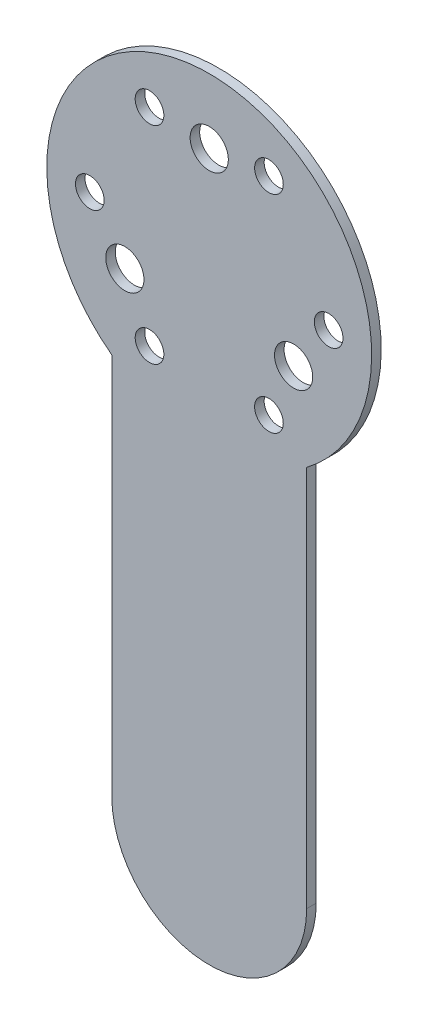
ISO-10303-21;
HEADER;
FILE_DESCRIPTION(('STEP AP214'),'2;1');
FILE_NAME('part.step','',(''),(''),'','','');
FILE_SCHEMA(('AUTOMOTIVE_DESIGN { 1 0 10303 214 1 1 1 1 }'));
ENDSEC;
DATA;
#1=APPLICATION_CONTEXT('core data for automotive mechanical design processes');
#2=APPLICATION_PROTOCOL_DEFINITION('international standard','automotive_design',2000,#1);
#3=PRODUCT_CONTEXT('',#1,'mechanical');
#4=PRODUCT('Part','Part','',(#3));
#5=PRODUCT_RELATED_PRODUCT_CATEGORY('part','',(#4));
#6=PRODUCT_DEFINITION_FORMATION('','',#4);
#7=PRODUCT_DEFINITION_CONTEXT('part definition',#1,'design');
#8=PRODUCT_DEFINITION('design','',#6,#7);
#9=PRODUCT_DEFINITION_SHAPE('','',#8);
#10=(LENGTH_UNIT() NAMED_UNIT(*) SI_UNIT(.MILLI.,.METRE.));
#11=(NAMED_UNIT(*) PLANE_ANGLE_UNIT() SI_UNIT($,.RADIAN.));
#12=(NAMED_UNIT(*) SI_UNIT($,.STERADIAN.) SOLID_ANGLE_UNIT());
#13=UNCERTAINTY_MEASURE_WITH_UNIT(LENGTH_MEASURE(1.E-05),#10,'distance_accuracy_value','');
#14=(GEOMETRIC_REPRESENTATION_CONTEXT(3) GLOBAL_UNCERTAINTY_ASSIGNED_CONTEXT((#13)) GLOBAL_UNIT_ASSIGNED_CONTEXT((#10,
#11,#12)) REPRESENTATION_CONTEXT('',''));
#15=CARTESIAN_POINT('',(0.,0.,0.));
#16=DIRECTION('',(0.,0.,1.));
#17=DIRECTION('',(1.,0.,0.));
#18=AXIS2_PLACEMENT_3D('',#15,#16,#17);
#19=CARTESIAN_POINT('',(0.,0.,1.));
#20=DIRECTION('',(0.,0.,1.));
#21=DIRECTION('',(1.,0.,0.));
#22=AXIS2_PLACEMENT_3D('',#19,#20,#21);
#23=PLANE('',#22);
#24=CARTESIAN_POINT('',(6.2499999999999,-10.8253175473055,1.));
#25=DIRECTION('',(0.,0.,1.));
#26=DIRECTION('',(1.,0.,0.));
#27=AXIS2_PLACEMENT_3D('',#24,#25,#26);
#28=CIRCLE('',#27,1.5);
#29=CARTESIAN_POINT('',(7.7499999999999,-10.8253175473055,1.));
#30=VERTEX_POINT('',#29);
#31=EDGE_CURVE('E151',#30,#30,#28,.T.);
#32=ORIENTED_EDGE('',*,*,#31,.F.);
#33=EDGE_LOOP('',(#32));
#34=FACE_BOUND('',#33,.T.);
#35=CARTESIAN_POINT('',(6.25000000000005,10.8253175473055,1.));
#36=DIRECTION('',(0.,0.,1.));
#37=DIRECTION('',(1.,0.,0.));
#38=AXIS2_PLACEMENT_3D('',#35,#36,#37);
#39=CIRCLE('',#38,1.5);
#40=CARTESIAN_POINT('',(7.75000000000005,10.8253175473055,1.));
#41=VERTEX_POINT('',#40);
#42=EDGE_CURVE('E139',#41,#41,#39,.T.);
#43=ORIENTED_EDGE('',*,*,#42,.F.);
#44=EDGE_LOOP('',(#43));
#45=FACE_BOUND('',#44,.T.);
#46=CARTESIAN_POINT('',(-8.83345911859867,-5.10000000000151,1.));
#47=DIRECTION('',(0.,0.,1.));
#48=DIRECTION('',(1.,0.,0.));
#49=AXIS2_PLACEMENT_3D('',#46,#47,#48);
#50=CIRCLE('',#49,2.00000000000302);
#51=CARTESIAN_POINT('',(-6.83345911859565,-5.10000000000151,1.));
#52=VERTEX_POINT('',#51);
#53=EDGE_CURVE('E127',#52,#52,#50,.T.);
#54=ORIENTED_EDGE('',*,*,#53,.F.);
#55=EDGE_LOOP('',(#54));
#56=FACE_BOUND('',#55,.T.);
#57=CARTESIAN_POINT('',(-12.5,0.,1.));
#58=DIRECTION('',(0.,0.,1.));
#59=DIRECTION('',(1.,0.,0.));
#60=AXIS2_PLACEMENT_3D('',#57,#58,#59);
#61=CIRCLE('',#60,1.5);
#62=CARTESIAN_POINT('',(-11.,0.,1.));
#63=VERTEX_POINT('',#62);
#64=EDGE_CURVE('E115',#63,#63,#61,.T.);
#65=ORIENTED_EDGE('',*,*,#64,.F.);
#66=EDGE_LOOP('',(#65));
#67=FACE_BOUND('',#66,.T.);
#68=CARTESIAN_POINT('',(0.,0.,1.));
#69=DIRECTION('',(0.,0.,1.));
#70=DIRECTION('',(1.,0.,0.));
#71=AXIS2_PLACEMENT_3D('',#68,#69,#70);
#72=CIRCLE('',#71,17.);
#73=CARTESIAN_POINT('',(10.2,-13.6,1.));
#74=VERTEX_POINT('',#73);
#75=CARTESIAN_POINT('',(-10.2,-13.6,1.));
#76=VERTEX_POINT('',#75);
#77=EDGE_CURVE('E85',#74,#76,#72,.T.);
#78=ORIENTED_EDGE('',*,*,#77,.T.);
#79=DIRECTION('',(0.,-1.,0.));
#80=VECTOR('',#79,1.);
#81=CARTESIAN_POINT('',(-10.2,-13.6,1.));
#82=LINE('',#81,#80);
#83=CARTESIAN_POINT('',(-10.2,-53.6,1.));
#84=VERTEX_POINT('',#83);
#85=EDGE_CURVE('E80',#76,#84,#82,.T.);
#86=ORIENTED_EDGE('',*,*,#85,.T.);
#87=CARTESIAN_POINT('',(0.,-53.6,1.));
#88=DIRECTION('',(0.,0.,1.));
#89=DIRECTION('',(1.,0.,0.));
#90=AXIS2_PLACEMENT_3D('',#87,#88,#89);
#91=CIRCLE('',#90,10.2);
#92=CARTESIAN_POINT('',(10.2,-53.6,1.));
#93=VERTEX_POINT('',#92);
#94=EDGE_CURVE('E83',#84,#93,#91,.T.);
#95=ORIENTED_EDGE('',*,*,#94,.T.);
#96=DIRECTION('',(0.,1.,0.));
#97=VECTOR('',#96,1.);
#98=CARTESIAN_POINT('',(10.2,-13.6,1.));
#99=LINE('',#98,#97);
#100=EDGE_CURVE('E50',#93,#74,#99,.T.);
#101=ORIENTED_EDGE('',*,*,#100,.T.);
#102=EDGE_LOOP('',(#78,#86,#95,#101));
#103=FACE_BOUND('',#102,.T.);
#104=CARTESIAN_POINT('',(0.,10.2,1.));
#105=DIRECTION('',(0.,0.,1.));
#106=DIRECTION('',(1.,0.,0.));
#107=AXIS2_PLACEMENT_3D('',#104,#105,#106);
#108=CIRCLE('',#107,2.);
#109=CARTESIAN_POINT('',(2.,10.2,1.));
#110=VERTEX_POINT('',#109);
#111=EDGE_CURVE('E100',#110,#110,#108,.T.);
#112=ORIENTED_EDGE('',*,*,#111,.F.);
#113=EDGE_LOOP('',(#112));
#114=FACE_BOUND('',#113,.T.);
#115=CARTESIAN_POINT('',(8.83345911860389,-5.09999999999849,1.));
#116=DIRECTION('',(0.,0.,1.));
#117=DIRECTION('',(1.,0.,0.));
#118=AXIS2_PLACEMENT_3D('',#115,#116,#117);
#119=CIRCLE('',#118,2.00000000000211);
#120=CARTESIAN_POINT('',(10.833459118606,-5.09999999999849,1.));
#121=VERTEX_POINT('',#120);
#122=EDGE_CURVE('E121',#121,#121,#119,.T.);
#123=ORIENTED_EDGE('',*,*,#122,.F.);
#124=EDGE_LOOP('',(#123));
#125=FACE_BOUND('',#124,.T.);
#126=CARTESIAN_POINT('',(-6.24999999999998,10.8253175473055,1.));
#127=DIRECTION('',(0.,0.,1.));
#128=DIRECTION('',(1.,0.,0.));
#129=AXIS2_PLACEMENT_3D('',#126,#127,#128);
#130=CIRCLE('',#129,1.5);
#131=CARTESIAN_POINT('',(-4.74999999999998,10.8253175473055,1.));
#132=VERTEX_POINT('',#131);
#133=EDGE_CURVE('E133',#132,#132,#130,.T.);
#134=ORIENTED_EDGE('',*,*,#133,.F.);
#135=EDGE_LOOP('',(#134));
#136=FACE_BOUND('',#135,.T.);
#137=CARTESIAN_POINT('',(12.5,0.,1.));
#138=DIRECTION('',(0.,0.,1.));
#139=DIRECTION('',(1.,0.,0.));
#140=AXIS2_PLACEMENT_3D('',#137,#138,#139);
#141=CIRCLE('',#140,1.5);
#142=CARTESIAN_POINT('',(14.,0.,1.));
#143=VERTEX_POINT('',#142);
#144=EDGE_CURVE('E145',#143,#143,#141,.T.);
#145=ORIENTED_EDGE('',*,*,#144,.F.);
#146=EDGE_LOOP('',(#145));
#147=FACE_BOUND('',#146,.T.);
#148=CARTESIAN_POINT('',(-6.25000000000013,-10.8253175473054,1.));
#149=DIRECTION('',(0.,0.,1.));
#150=DIRECTION('',(1.,0.,0.));
#151=AXIS2_PLACEMENT_3D('',#148,#149,#150);
#152=CIRCLE('',#151,1.5);
#153=CARTESIAN_POINT('',(-4.75000000000013,-10.8253175473054,1.));
#154=VERTEX_POINT('',#153);
#155=EDGE_CURVE('E157',#154,#154,#152,.T.);
#156=ORIENTED_EDGE('',*,*,#155,.F.);
#157=EDGE_LOOP('',(#156));
#158=FACE_BOUND('',#157,.T.);
#159=ADVANCED_FACE('F33',(#34,#45,#56,#67,#103,#114,#125,#136,#147,#158),#23,.T.);
#160=CARTESIAN_POINT('',(0.,0.,0.));
#161=DIRECTION('',(0.,0.,1.));
#162=DIRECTION('',(1.,0.,0.));
#163=AXIS2_PLACEMENT_3D('',#160,#161,#162);
#164=PLANE('',#163);
#165=CARTESIAN_POINT('',(0.,0.,0.));
#166=DIRECTION('',(0.,0.,1.));
#167=DIRECTION('',(1.,0.,0.));
#168=AXIS2_PLACEMENT_3D('',#165,#166,#167);
#169=CIRCLE('',#168,17.);
#170=CARTESIAN_POINT('',(10.2,-13.6,0.));
#171=VERTEX_POINT('',#170);
#172=CARTESIAN_POINT('',(-10.2,-13.6,0.));
#173=VERTEX_POINT('',#172);
#174=EDGE_CURVE('E97',#171,#173,#169,.T.);
#175=ORIENTED_EDGE('',*,*,#174,.F.);
#176=DIRECTION('',(0.,1.,0.));
#177=VECTOR('',#176,1.);
#178=CARTESIAN_POINT('',(10.2,-13.6,0.));
#179=LINE('',#178,#177);
#180=CARTESIAN_POINT('',(10.2,-53.6,0.));
#181=VERTEX_POINT('',#180);
#182=EDGE_CURVE('E73',#181,#171,#179,.T.);
#183=ORIENTED_EDGE('',*,*,#182,.F.);
#184=CARTESIAN_POINT('',(0.,-53.6,0.));
#185=DIRECTION('',(0.,0.,1.));
#186=DIRECTION('',(1.,0.,0.));
#187=AXIS2_PLACEMENT_3D('',#184,#185,#186);
#188=CIRCLE('',#187,10.2);
#189=CARTESIAN_POINT('',(-10.2,-53.6,0.));
#190=VERTEX_POINT('',#189);
#191=EDGE_CURVE('E67',#190,#181,#188,.T.);
#192=ORIENTED_EDGE('',*,*,#191,.F.);
#193=DIRECTION('',(0.,-1.,0.));
#194=VECTOR('',#193,1.);
#195=CARTESIAN_POINT('',(-10.2,-13.6,0.));
#196=LINE('',#195,#194);
#197=EDGE_CURVE('E89',#173,#190,#196,.T.);
#198=ORIENTED_EDGE('',*,*,#197,.F.);
#199=EDGE_LOOP('',(#175,#183,#192,#198));
#200=FACE_BOUND('',#199,.T.);
#201=CARTESIAN_POINT('',(0.,10.2,0.));
#202=DIRECTION('',(0.,0.,1.));
#203=DIRECTION('',(1.,0.,0.));
#204=AXIS2_PLACEMENT_3D('',#201,#202,#203);
#205=CIRCLE('',#204,2.);
#206=CARTESIAN_POINT('',(2.,10.2,0.));
#207=VERTEX_POINT('',#206);
#208=EDGE_CURVE('E112',#207,#207,#205,.T.);
#209=ORIENTED_EDGE('',*,*,#208,.T.);
#210=EDGE_LOOP('',(#209));
#211=FACE_BOUND('',#210,.T.);
#212=CARTESIAN_POINT('',(-12.5,0.,0.));
#213=DIRECTION('',(0.,0.,1.));
#214=DIRECTION('',(1.,0.,0.));
#215=AXIS2_PLACEMENT_3D('',#212,#213,#214);
#216=CIRCLE('',#215,1.5);
#217=CARTESIAN_POINT('',(-11.,0.,0.));
#218=VERTEX_POINT('',#217);
#219=EDGE_CURVE('E118',#218,#218,#216,.T.);
#220=ORIENTED_EDGE('',*,*,#219,.T.);
#221=EDGE_LOOP('',(#220));
#222=FACE_BOUND('',#221,.T.);
#223=CARTESIAN_POINT('',(8.83345911860389,-5.09999999999849,0.));
#224=DIRECTION('',(0.,0.,1.));
#225=DIRECTION('',(1.,0.,0.));
#226=AXIS2_PLACEMENT_3D('',#223,#224,#225);
#227=CIRCLE('',#226,2.00000000000211);
#228=CARTESIAN_POINT('',(10.833459118606,-5.09999999999849,0.));
#229=VERTEX_POINT('',#228);
#230=EDGE_CURVE('E124',#229,#229,#227,.T.);
#231=ORIENTED_EDGE('',*,*,#230,.T.);
#232=EDGE_LOOP('',(#231));
#233=FACE_BOUND('',#232,.T.);
#234=CARTESIAN_POINT('',(-8.83345911859867,-5.10000000000151,0.));
#235=DIRECTION('',(0.,0.,1.));
#236=DIRECTION('',(1.,0.,0.));
#237=AXIS2_PLACEMENT_3D('',#234,#235,#236);
#238=CIRCLE('',#237,2.00000000000302);
#239=CARTESIAN_POINT('',(-6.83345911859565,-5.10000000000151,0.));
#240=VERTEX_POINT('',#239);
#241=EDGE_CURVE('E130',#240,#240,#238,.T.);
#242=ORIENTED_EDGE('',*,*,#241,.T.);
#243=EDGE_LOOP('',(#242));
#244=FACE_BOUND('',#243,.T.);
#245=CARTESIAN_POINT('',(-6.24999999999998,10.8253175473055,0.));
#246=DIRECTION('',(0.,0.,1.));
#247=DIRECTION('',(1.,0.,0.));
#248=AXIS2_PLACEMENT_3D('',#245,#246,#247);
#249=CIRCLE('',#248,1.5);
#250=CARTESIAN_POINT('',(-4.74999999999998,10.8253175473055,0.));
#251=VERTEX_POINT('',#250);
#252=EDGE_CURVE('E136',#251,#251,#249,.T.);
#253=ORIENTED_EDGE('',*,*,#252,.T.);
#254=EDGE_LOOP('',(#253));
#255=FACE_BOUND('',#254,.T.);
#256=CARTESIAN_POINT('',(6.25000000000005,10.8253175473055,0.));
#257=DIRECTION('',(0.,0.,1.));
#258=DIRECTION('',(1.,0.,0.));
#259=AXIS2_PLACEMENT_3D('',#256,#257,#258);
#260=CIRCLE('',#259,1.5);
#261=CARTESIAN_POINT('',(7.75000000000005,10.8253175473055,0.));
#262=VERTEX_POINT('',#261);
#263=EDGE_CURVE('E142',#262,#262,#260,.T.);
#264=ORIENTED_EDGE('',*,*,#263,.T.);
#265=EDGE_LOOP('',(#264));
#266=FACE_BOUND('',#265,.T.);
#267=CARTESIAN_POINT('',(12.5,0.,0.));
#268=DIRECTION('',(0.,0.,1.));
#269=DIRECTION('',(1.,0.,0.));
#270=AXIS2_PLACEMENT_3D('',#267,#268,#269);
#271=CIRCLE('',#270,1.5);
#272=CARTESIAN_POINT('',(14.,0.,0.));
#273=VERTEX_POINT('',#272);
#274=EDGE_CURVE('E148',#273,#273,#271,.T.);
#275=ORIENTED_EDGE('',*,*,#274,.T.);
#276=EDGE_LOOP('',(#275));
#277=FACE_BOUND('',#276,.T.);
#278=CARTESIAN_POINT('',(6.2499999999999,-10.8253175473055,0.));
#279=DIRECTION('',(0.,0.,1.));
#280=DIRECTION('',(1.,0.,0.));
#281=AXIS2_PLACEMENT_3D('',#278,#279,#280);
#282=CIRCLE('',#281,1.5);
#283=CARTESIAN_POINT('',(7.7499999999999,-10.8253175473055,0.));
#284=VERTEX_POINT('',#283);
#285=EDGE_CURVE('E154',#284,#284,#282,.T.);
#286=ORIENTED_EDGE('',*,*,#285,.T.);
#287=EDGE_LOOP('',(#286));
#288=FACE_BOUND('',#287,.T.);
#289=CARTESIAN_POINT('',(-6.25000000000013,-10.8253175473054,0.));
#290=DIRECTION('',(0.,0.,1.));
#291=DIRECTION('',(1.,0.,0.));
#292=AXIS2_PLACEMENT_3D('',#289,#290,#291);
#293=CIRCLE('',#292,1.5);
#294=CARTESIAN_POINT('',(-4.75000000000013,-10.8253175473054,0.));
#295=VERTEX_POINT('',#294);
#296=EDGE_CURVE('E160',#295,#295,#293,.T.);
#297=ORIENTED_EDGE('',*,*,#296,.T.);
#298=EDGE_LOOP('',(#297));
#299=FACE_BOUND('',#298,.T.);
#300=ADVANCED_FACE('F108',(#200,#211,#222,#233,#244,#255,#266,#277,#288,#299),#164,.F.);
#301=CARTESIAN_POINT('',(0.,0.,1.));
#302=DIRECTION('',(0.,0.,-1.));
#303=DIRECTION('',(-1.,0.,0.));
#304=AXIS2_PLACEMENT_3D('',#301,#302,#303);
#305=CYLINDRICAL_SURFACE('',#304,17.);
#306=ORIENTED_EDGE('',*,*,#174,.T.);
#307=DIRECTION('',(0.,0.,-1.));
#308=VECTOR('',#307,1.);
#309=CARTESIAN_POINT('',(-10.2,-13.6,1.));
#310=LINE('',#309,#308);
#311=EDGE_CURVE('E11',#76,#173,#310,.T.);
#312=ORIENTED_EDGE('',*,*,#311,.F.);
#313=ORIENTED_EDGE('',*,*,#77,.F.);
#314=DIRECTION('',(0.,0.,-1.));
#315=VECTOR('',#314,1.);
#316=CARTESIAN_POINT('',(10.2,-13.6,1.));
#317=LINE('',#316,#315);
#318=EDGE_CURVE('E93',#74,#171,#317,.T.);
#319=ORIENTED_EDGE('',*,*,#318,.T.);
#320=EDGE_LOOP('',(#306,#312,#313,#319));
#321=FACE_BOUND('',#320,.T.);
#322=ADVANCED_FACE('F35',(#321),#305,.T.);
#323=CARTESIAN_POINT('',(-10.2,-13.6,1.));
#324=DIRECTION('',(1.,0.,0.));
#325=DIRECTION('',(0.,1.,0.));
#326=AXIS2_PLACEMENT_3D('',#323,#324,#325);
#327=PLANE('',#326);
#328=ORIENTED_EDGE('',*,*,#197,.T.);
#329=DIRECTION('',(0.,0.,-1.));
#330=VECTOR('',#329,1.);
#331=CARTESIAN_POINT('',(-10.2,-53.6,1.));
#332=LINE('',#331,#330);
#333=EDGE_CURVE('E42',#84,#190,#332,.T.);
#334=ORIENTED_EDGE('',*,*,#333,.F.);
#335=ORIENTED_EDGE('',*,*,#85,.F.);
#336=ORIENTED_EDGE('',*,*,#311,.T.);
#337=EDGE_LOOP('',(#328,#334,#335,#336));
#338=FACE_BOUND('',#337,.T.);
#339=ADVANCED_FACE('F88',(#338),#327,.F.);
#340=CARTESIAN_POINT('',(0.,-53.6,1.));
#341=DIRECTION('',(0.,0.,-1.));
#342=DIRECTION('',(-1.,0.,0.));
#343=AXIS2_PLACEMENT_3D('',#340,#341,#342);
#344=CYLINDRICAL_SURFACE('',#343,10.2);
#345=ORIENTED_EDGE('',*,*,#191,.T.);
#346=DIRECTION('',(0.,0.,-1.));
#347=VECTOR('',#346,1.);
#348=CARTESIAN_POINT('',(10.2,-53.6,1.));
#349=LINE('',#348,#347);
#350=EDGE_CURVE('E90',#93,#181,#349,.T.);
#351=ORIENTED_EDGE('',*,*,#350,.F.);
#352=ORIENTED_EDGE('',*,*,#94,.F.);
#353=ORIENTED_EDGE('',*,*,#333,.T.);
#354=EDGE_LOOP('',(#345,#351,#352,#353));
#355=FACE_BOUND('',#354,.T.);
#356=ADVANCED_FACE('F91',(#355),#344,.T.);
#357=CARTESIAN_POINT('',(10.2,-13.6,1.));
#358=DIRECTION('',(-1.,0.,0.));
#359=DIRECTION('',(0.,-1.,0.));
#360=AXIS2_PLACEMENT_3D('',#357,#358,#359);
#361=PLANE('',#360);
#362=ORIENTED_EDGE('',*,*,#182,.T.);
#363=ORIENTED_EDGE('',*,*,#318,.F.);
#364=ORIENTED_EDGE('',*,*,#100,.F.);
#365=ORIENTED_EDGE('',*,*,#350,.T.);
#366=EDGE_LOOP('',(#362,#363,#364,#365));
#367=FACE_BOUND('',#366,.T.);
#368=ADVANCED_FACE('F105',(#367),#361,.F.);
#369=CARTESIAN_POINT('',(0.,10.2,1.));
#370=DIRECTION('',(0.,0.,-1.));
#371=DIRECTION('',(-1.,0.,0.));
#372=AXIS2_PLACEMENT_3D('',#369,#370,#371);
#373=CYLINDRICAL_SURFACE('',#372,2.);
#374=ORIENTED_EDGE('',*,*,#111,.T.);
#375=EDGE_LOOP('',(#374));
#376=FACE_BOUND('',#375,.T.);
#377=ORIENTED_EDGE('',*,*,#208,.F.);
#378=EDGE_LOOP('',(#377));
#379=FACE_BOUND('',#378,.T.);
#380=ADVANCED_FACE('F179',(#376,#379),#373,.F.);
#381=CARTESIAN_POINT('',(-12.5,0.,1.));
#382=DIRECTION('',(0.,0.,-1.));
#383=DIRECTION('',(-1.,0.,0.));
#384=AXIS2_PLACEMENT_3D('',#381,#382,#383);
#385=CYLINDRICAL_SURFACE('',#384,1.5);
#386=ORIENTED_EDGE('',*,*,#64,.T.);
#387=EDGE_LOOP('',(#386));
#388=FACE_BOUND('',#387,.T.);
#389=ORIENTED_EDGE('',*,*,#219,.F.);
#390=EDGE_LOOP('',(#389));
#391=FACE_BOUND('',#390,.T.);
#392=ADVANCED_FACE('F225',(#388,#391),#385,.F.);
#393=CARTESIAN_POINT('',(8.83345911860389,-5.09999999999849,1.));
#394=DIRECTION('',(0.,0.,-1.));
#395=DIRECTION('',(-1.,0.,0.));
#396=AXIS2_PLACEMENT_3D('',#393,#394,#395);
#397=CYLINDRICAL_SURFACE('',#396,2.00000000000211);
#398=ORIENTED_EDGE('',*,*,#122,.T.);
#399=EDGE_LOOP('',(#398));
#400=FACE_BOUND('',#399,.T.);
#401=ORIENTED_EDGE('',*,*,#230,.F.);
#402=EDGE_LOOP('',(#401));
#403=FACE_BOUND('',#402,.T.);
#404=ADVANCED_FACE('F233',(#400,#403),#397,.F.);
#405=CARTESIAN_POINT('',(-8.83345911859867,-5.10000000000151,1.));
#406=DIRECTION('',(0.,0.,-1.));
#407=DIRECTION('',(-1.,0.,0.));
#408=AXIS2_PLACEMENT_3D('',#405,#406,#407);
#409=CYLINDRICAL_SURFACE('',#408,2.00000000000302);
#410=ORIENTED_EDGE('',*,*,#53,.T.);
#411=EDGE_LOOP('',(#410));
#412=FACE_BOUND('',#411,.T.);
#413=ORIENTED_EDGE('',*,*,#241,.F.);
#414=EDGE_LOOP('',(#413));
#415=FACE_BOUND('',#414,.T.);
#416=ADVANCED_FACE('F241',(#412,#415),#409,.F.);
#417=CARTESIAN_POINT('',(-6.24999999999998,10.8253175473055,1.));
#418=DIRECTION('',(0.,0.,-1.));
#419=DIRECTION('',(-1.,0.,0.));
#420=AXIS2_PLACEMENT_3D('',#417,#418,#419);
#421=CYLINDRICAL_SURFACE('',#420,1.5);
#422=ORIENTED_EDGE('',*,*,#133,.T.);
#423=EDGE_LOOP('',(#422));
#424=FACE_BOUND('',#423,.T.);
#425=ORIENTED_EDGE('',*,*,#252,.F.);
#426=EDGE_LOOP('',(#425));
#427=FACE_BOUND('',#426,.T.);
#428=ADVANCED_FACE('F250',(#424,#427),#421,.F.);
#429=CARTESIAN_POINT('',(6.25000000000005,10.8253175473055,1.));
#430=DIRECTION('',(0.,0.,-1.));
#431=DIRECTION('',(-1.,0.,0.));
#432=AXIS2_PLACEMENT_3D('',#429,#430,#431);
#433=CYLINDRICAL_SURFACE('',#432,1.5);
#434=ORIENTED_EDGE('',*,*,#42,.T.);
#435=EDGE_LOOP('',(#434));
#436=FACE_BOUND('',#435,.T.);
#437=ORIENTED_EDGE('',*,*,#263,.F.);
#438=EDGE_LOOP('',(#437));
#439=FACE_BOUND('',#438,.T.);
#440=ADVANCED_FACE('F259',(#436,#439),#433,.F.);
#441=CARTESIAN_POINT('',(12.5,0.,1.));
#442=DIRECTION('',(0.,0.,-1.));
#443=DIRECTION('',(-1.,0.,0.));
#444=AXIS2_PLACEMENT_3D('',#441,#442,#443);
#445=CYLINDRICAL_SURFACE('',#444,1.5);
#446=ORIENTED_EDGE('',*,*,#144,.T.);
#447=EDGE_LOOP('',(#446));
#448=FACE_BOUND('',#447,.T.);
#449=ORIENTED_EDGE('',*,*,#274,.F.);
#450=EDGE_LOOP('',(#449));
#451=FACE_BOUND('',#450,.T.);
#452=ADVANCED_FACE('F268',(#448,#451),#445,.F.);
#453=CARTESIAN_POINT('',(6.2499999999999,-10.8253175473055,1.));
#454=DIRECTION('',(0.,0.,-1.));
#455=DIRECTION('',(-1.,0.,0.));
#456=AXIS2_PLACEMENT_3D('',#453,#454,#455);
#457=CYLINDRICAL_SURFACE('',#456,1.5);
#458=ORIENTED_EDGE('',*,*,#31,.T.);
#459=EDGE_LOOP('',(#458));
#460=FACE_BOUND('',#459,.T.);
#461=ORIENTED_EDGE('',*,*,#285,.F.);
#462=EDGE_LOOP('',(#461));
#463=FACE_BOUND('',#462,.T.);
#464=ADVANCED_FACE('F277',(#460,#463),#457,.F.);
#465=CARTESIAN_POINT('',(-6.25000000000013,-10.8253175473054,1.));
#466=DIRECTION('',(0.,0.,-1.));
#467=DIRECTION('',(-1.,0.,0.));
#468=AXIS2_PLACEMENT_3D('',#465,#466,#467);
#469=CYLINDRICAL_SURFACE('',#468,1.5);
#470=ORIENTED_EDGE('',*,*,#155,.T.);
#471=EDGE_LOOP('',(#470));
#472=FACE_BOUND('',#471,.T.);
#473=ORIENTED_EDGE('',*,*,#296,.F.);
#474=EDGE_LOOP('',(#473));
#475=FACE_BOUND('',#474,.T.);
#476=ADVANCED_FACE('F166',(#472,#475),#469,.F.);
#477=CLOSED_SHELL('',(#159,#300,#322,#339,#356,#368,#380,#392,#404,#416,#428,#440,#452,#464,#476));
#478=MANIFOLD_SOLID_BREP('B2',#477);
#479=ADVANCED_BREP_SHAPE_REPRESENTATION('',(#18,#478),#14);
#480=SHAPE_DEFINITION_REPRESENTATION(#9,#479);
ENDSEC;
END-ISO-10303-21;
